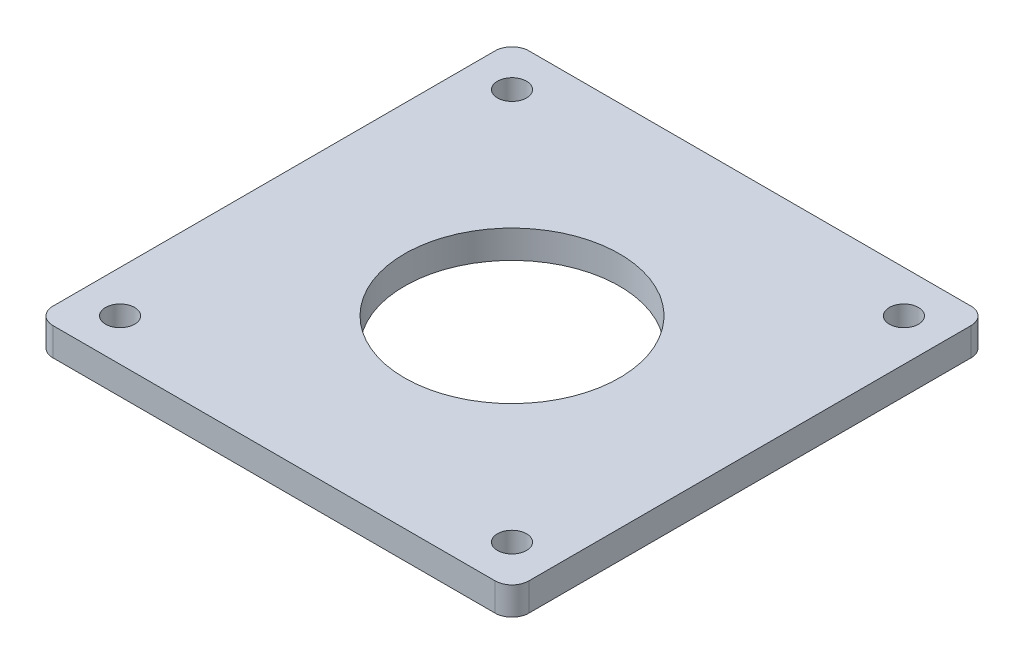
ISO-10303-21;
HEADER;
FILE_DESCRIPTION(('STEP AP214'),'2;1');
FILE_NAME('part.step','',(''),(''),'','','');
FILE_SCHEMA(('AUTOMOTIVE_DESIGN { 1 0 10303 214 1 1 1 1 }'));
ENDSEC;
DATA;
#1=APPLICATION_CONTEXT('core data for automotive mechanical design processes');
#2=APPLICATION_PROTOCOL_DEFINITION('international standard','automotive_design',2000,#1);
#3=PRODUCT_CONTEXT('',#1,'mechanical');
#4=PRODUCT('Part','Part','',(#3));
#5=PRODUCT_RELATED_PRODUCT_CATEGORY('part','',(#4));
#6=PRODUCT_DEFINITION_FORMATION('','',#4);
#7=PRODUCT_DEFINITION_CONTEXT('part definition',#1,'design');
#8=PRODUCT_DEFINITION('design','',#6,#7);
#9=PRODUCT_DEFINITION_SHAPE('','',#8);
#10=(LENGTH_UNIT() NAMED_UNIT(*) SI_UNIT(.MILLI.,.METRE.));
#11=(NAMED_UNIT(*) PLANE_ANGLE_UNIT() SI_UNIT($,.RADIAN.));
#12=(NAMED_UNIT(*) SI_UNIT($,.STERADIAN.) SOLID_ANGLE_UNIT());
#13=UNCERTAINTY_MEASURE_WITH_UNIT(LENGTH_MEASURE(1.E-05),#10,'distance_accuracy_value','');
#14=(GEOMETRIC_REPRESENTATION_CONTEXT(3) GLOBAL_UNCERTAINTY_ASSIGNED_CONTEXT((#13)) GLOBAL_UNIT_ASSIGNED_CONTEXT((#10,
#11,#12)) REPRESENTATION_CONTEXT('',''));
#15=CARTESIAN_POINT('',(0.,0.,0.));
#16=DIRECTION('',(0.,0.,1.));
#17=DIRECTION('',(1.,0.,0.));
#18=AXIS2_PLACEMENT_3D('',#15,#16,#17);
#19=CARTESIAN_POINT('',(0.,2.5,0.));
#20=DIRECTION('',(0.,1.,0.));
#21=DIRECTION('',(0.,0.,1.));
#22=AXIS2_PLACEMENT_3D('',#19,#20,#21);
#23=PLANE('',#22);
#24=CARTESIAN_POINT('',(35.00178566873,2.5,-35.00178566873));
#25=DIRECTION('',(0.,1.,0.));
#26=DIRECTION('',(0.,0.,1.));
#27=AXIS2_PLACEMENT_3D('',#24,#25,#26);
#28=CIRCLE('',#27,2.6);
#29=CARTESIAN_POINT('',(35.00178566873,2.5,-32.40178566873));
#30=VERTEX_POINT('',#29);
#31=EDGE_CURVE('E139',#30,#30,#28,.F.);
#32=ORIENTED_EDGE('',*,*,#31,.T.);
#33=EDGE_LOOP('',(#32));
#34=FACE_BOUND('',#33,.T.);
#35=CARTESIAN_POINT('',(35.00178566873,2.5,35.00178566873));
#36=DIRECTION('',(0.,1.,0.));
#37=DIRECTION('',(0.,0.,1.));
#38=AXIS2_PLACEMENT_3D('',#35,#36,#37);
#39=CIRCLE('',#38,2.6);
#40=CARTESIAN_POINT('',(35.00178566873,2.5,37.60178566873));
#41=VERTEX_POINT('',#40);
#42=EDGE_CURVE('E142',#41,#41,#39,.F.);
#43=ORIENTED_EDGE('',*,*,#42,.T.);
#44=EDGE_LOOP('',(#43));
#45=FACE_BOUND('',#44,.T.);
#46=CARTESIAN_POINT('',(-35.00178566873,2.5,35.00178566873));
#47=DIRECTION('',(0.,1.,0.));
#48=DIRECTION('',(0.,0.,1.));
#49=AXIS2_PLACEMENT_3D('',#46,#47,#48);
#50=CIRCLE('',#49,2.6);
#51=CARTESIAN_POINT('',(-35.00178566873,2.5,37.60178566873));
#52=VERTEX_POINT('',#51);
#53=EDGE_CURVE('E145',#52,#52,#50,.F.);
#54=ORIENTED_EDGE('',*,*,#53,.T.);
#55=EDGE_LOOP('',(#54));
#56=FACE_BOUND('',#55,.T.);
#57=CARTESIAN_POINT('',(-35.00178566873,2.5,-35.00178566873));
#58=DIRECTION('',(0.,1.,0.));
#59=DIRECTION('',(0.,0.,1.));
#60=AXIS2_PLACEMENT_3D('',#57,#58,#59);
#61=CIRCLE('',#60,2.6);
#62=CARTESIAN_POINT('',(-35.00178566873,2.5,-32.40178566873));
#63=VERTEX_POINT('',#62);
#64=EDGE_CURVE('E148',#63,#63,#61,.F.);
#65=ORIENTED_EDGE('',*,*,#64,.T.);
#66=EDGE_LOOP('',(#65));
#67=FACE_BOUND('',#66,.T.);
#68=CARTESIAN_POINT('',(0.,2.5,0.));
#69=DIRECTION('',(0.,1.,0.));
#70=DIRECTION('',(0.,0.,1.));
#71=AXIS2_PLACEMENT_3D('',#68,#69,#70);
#72=CIRCLE('',#71,19.2);
#73=CARTESIAN_POINT('',(0.,2.5,19.2));
#74=VERTEX_POINT('',#73);
#75=EDGE_CURVE('E151',#74,#74,#72,.F.);
#76=ORIENTED_EDGE('',*,*,#75,.T.);
#77=EDGE_LOOP('',(#76));
#78=FACE_BOUND('',#77,.T.);
#79=DIRECTION('',(0.,0.,1.));
#80=VECTOR('',#79,1.);
#81=CARTESIAN_POINT('',(-42.5,2.5,-39.5));
#82=LINE('',#81,#80);
#83=CARTESIAN_POINT('',(-42.5,2.5,39.5));
#84=VERTEX_POINT('',#83);
#85=CARTESIAN_POINT('',(-42.5,2.5,-39.5));
#86=VERTEX_POINT('',#85);
#87=EDGE_CURVE('E93',#84,#86,#82,.F.);
#88=ORIENTED_EDGE('',*,*,#87,.F.);
#89=CARTESIAN_POINT('',(-39.5,2.5,39.5));
#90=DIRECTION('',(0.,1.,0.));
#91=DIRECTION('',(0.,0.,1.));
#92=AXIS2_PLACEMENT_3D('',#89,#90,#91);
#93=CIRCLE('',#92,3.);
#94=CARTESIAN_POINT('',(-39.5,2.5,42.5));
#95=VERTEX_POINT('',#94);
#96=EDGE_CURVE('E20',#95,#84,#93,.F.);
#97=ORIENTED_EDGE('',*,*,#96,.F.);
#98=DIRECTION('',(1.,0.,0.));
#99=VECTOR('',#98,1.);
#100=CARTESIAN_POINT('',(-39.5,2.5,42.5));
#101=LINE('',#100,#99);
#102=CARTESIAN_POINT('',(39.5,2.5,42.5));
#103=VERTEX_POINT('',#102);
#104=EDGE_CURVE('E79',#103,#95,#101,.F.);
#105=ORIENTED_EDGE('',*,*,#104,.F.);
#106=CARTESIAN_POINT('',(39.5,2.5,39.5));
#107=DIRECTION('',(0.,1.,0.));
#108=DIRECTION('',(0.,0.,1.));
#109=AXIS2_PLACEMENT_3D('',#106,#107,#108);
#110=CIRCLE('',#109,3.);
#111=CARTESIAN_POINT('',(42.5,2.5,39.5));
#112=VERTEX_POINT('',#111);
#113=EDGE_CURVE('E100',#112,#103,#110,.F.);
#114=ORIENTED_EDGE('',*,*,#113,.F.);
#115=DIRECTION('',(0.,0.,-1.));
#116=VECTOR('',#115,1.);
#117=CARTESIAN_POINT('',(42.5,2.5,39.5));
#118=LINE('',#117,#116);
#119=CARTESIAN_POINT('',(42.5,2.5,-39.5));
#120=VERTEX_POINT('',#119);
#121=EDGE_CURVE('E111',#120,#112,#118,.F.);
#122=ORIENTED_EDGE('',*,*,#121,.F.);
#123=CARTESIAN_POINT('',(39.5,2.5,-39.5));
#124=DIRECTION('',(0.,1.,0.));
#125=DIRECTION('',(0.,0.,1.));
#126=AXIS2_PLACEMENT_3D('',#123,#124,#125);
#127=CIRCLE('',#126,3.);
#128=CARTESIAN_POINT('',(39.5,2.5,-42.5));
#129=VERTEX_POINT('',#128);
#130=EDGE_CURVE('E157',#129,#120,#127,.F.);
#131=ORIENTED_EDGE('',*,*,#130,.F.);
#132=DIRECTION('',(-1.,0.,0.));
#133=VECTOR('',#132,1.);
#134=CARTESIAN_POINT('',(39.5,2.5,-42.5));
#135=LINE('',#134,#133);
#136=CARTESIAN_POINT('',(-39.5,2.5,-42.5));
#137=VERTEX_POINT('',#136);
#138=EDGE_CURVE('E107',#137,#129,#135,.F.);
#139=ORIENTED_EDGE('',*,*,#138,.F.);
#140=CARTESIAN_POINT('',(-39.5,2.5,-39.5));
#141=DIRECTION('',(0.,1.,0.));
#142=DIRECTION('',(0.,0.,1.));
#143=AXIS2_PLACEMENT_3D('',#140,#141,#142);
#144=CIRCLE('',#143,3.);
#145=EDGE_CURVE('E154',#86,#137,#144,.F.);
#146=ORIENTED_EDGE('',*,*,#145,.F.);
#147=EDGE_LOOP('',(#88,#97,#105,#114,#122,#131,#139,#146));
#148=FACE_BOUND('',#147,.T.);
#149=ADVANCED_FACE('F17',(#34,#45,#56,#67,#78,#148),#23,.T.);
#150=CARTESIAN_POINT('',(-39.5,-2.5,39.5));
#151=DIRECTION('',(0.,1.,0.));
#152=DIRECTION('',(0.,0.,1.));
#153=AXIS2_PLACEMENT_3D('',#150,#151,#152);
#154=CYLINDRICAL_SURFACE('',#153,3.);
#155=DIRECTION('',(0.,1.,0.));
#156=VECTOR('',#155,1.);
#157=CARTESIAN_POINT('',(-42.5,-2.5,39.5));
#158=LINE('',#157,#156);
#159=CARTESIAN_POINT('',(-42.5,-2.5,39.5));
#160=VERTEX_POINT('',#159);
#161=EDGE_CURVE('E106',#160,#84,#158,.T.);
#162=ORIENTED_EDGE('',*,*,#161,.F.);
#163=CARTESIAN_POINT('',(-39.5,-2.5,39.5));
#164=DIRECTION('',(0.,1.,0.));
#165=DIRECTION('',(0.,0.,1.));
#166=AXIS2_PLACEMENT_3D('',#163,#164,#165);
#167=CIRCLE('',#166,3.);
#168=CARTESIAN_POINT('',(-39.5,-2.5,42.5));
#169=VERTEX_POINT('',#168);
#170=EDGE_CURVE('E99',#160,#169,#167,.T.);
#171=ORIENTED_EDGE('',*,*,#170,.T.);
#172=DIRECTION('',(0.,1.,0.));
#173=VECTOR('',#172,1.);
#174=CARTESIAN_POINT('',(-39.5,-2.5,42.5));
#175=LINE('',#174,#173);
#176=EDGE_CURVE('E84',#95,#169,#175,.F.);
#177=ORIENTED_EDGE('',*,*,#176,.F.);
#178=ORIENTED_EDGE('',*,*,#96,.T.);
#179=EDGE_LOOP('',(#162,#171,#177,#178));
#180=FACE_BOUND('',#179,.T.);
#181=ADVANCED_FACE('F98',(#180),#154,.T.);
#182=CARTESIAN_POINT('',(-39.5,-2.5,42.5));
#183=DIRECTION('',(0.,0.,1.));
#184=DIRECTION('',(1.,0.,0.));
#185=AXIS2_PLACEMENT_3D('',#182,#183,#184);
#186=PLANE('',#185);
#187=ORIENTED_EDGE('',*,*,#176,.T.);
#188=DIRECTION('',(1.,0.,0.));
#189=VECTOR('',#188,1.);
#190=CARTESIAN_POINT('',(0.,-2.5,42.5));
#191=LINE('',#190,#189);
#192=CARTESIAN_POINT('',(39.5,-2.5,42.5));
#193=VERTEX_POINT('',#192);
#194=EDGE_CURVE('E137',#169,#193,#191,.T.);
#195=ORIENTED_EDGE('',*,*,#194,.T.);
#196=DIRECTION('',(0.,1.,0.));
#197=VECTOR('',#196,1.);
#198=CARTESIAN_POINT('',(39.5,-2.5,42.5));
#199=LINE('',#198,#197);
#200=EDGE_CURVE('E86',#103,#193,#199,.F.);
#201=ORIENTED_EDGE('',*,*,#200,.F.);
#202=ORIENTED_EDGE('',*,*,#104,.T.);
#203=EDGE_LOOP('',(#187,#195,#201,#202));
#204=FACE_BOUND('',#203,.T.);
#205=ADVANCED_FACE('F81',(#204),#186,.T.);
#206=CARTESIAN_POINT('',(39.5,-2.5,39.5));
#207=DIRECTION('',(0.,1.,0.));
#208=DIRECTION('',(0.,0.,1.));
#209=AXIS2_PLACEMENT_3D('',#206,#207,#208);
#210=CYLINDRICAL_SURFACE('',#209,3.);
#211=ORIENTED_EDGE('',*,*,#200,.T.);
#212=CARTESIAN_POINT('',(39.5,-2.5,39.5));
#213=DIRECTION('',(0.,1.,0.));
#214=DIRECTION('',(0.,0.,1.));
#215=AXIS2_PLACEMENT_3D('',#212,#213,#214);
#216=CIRCLE('',#215,3.);
#217=CARTESIAN_POINT('',(42.5,-2.5,39.5));
#218=VERTEX_POINT('',#217);
#219=EDGE_CURVE('E134',#193,#218,#216,.T.);
#220=ORIENTED_EDGE('',*,*,#219,.T.);
#221=DIRECTION('',(0.,1.,0.));
#222=VECTOR('',#221,1.);
#223=CARTESIAN_POINT('',(42.5,-2.5,39.5));
#224=LINE('',#223,#222);
#225=EDGE_CURVE('E112',#112,#218,#224,.F.);
#226=ORIENTED_EDGE('',*,*,#225,.F.);
#227=ORIENTED_EDGE('',*,*,#113,.T.);
#228=EDGE_LOOP('',(#211,#220,#226,#227));
#229=FACE_BOUND('',#228,.T.);
#230=ADVANCED_FACE('F193',(#229),#210,.T.);
#231=CARTESIAN_POINT('',(42.5,-2.5,39.5));
#232=DIRECTION('',(1.,0.,0.));
#233=DIRECTION('',(0.,0.,-1.));
#234=AXIS2_PLACEMENT_3D('',#231,#232,#233);
#235=PLANE('',#234);
#236=ORIENTED_EDGE('',*,*,#225,.T.);
#237=DIRECTION('',(0.,0.,1.));
#238=VECTOR('',#237,1.);
#239=CARTESIAN_POINT('',(42.5,-2.5,0.));
#240=LINE('',#239,#238);
#241=CARTESIAN_POINT('',(42.5,-2.5,-39.5));
#242=VERTEX_POINT('',#241);
#243=EDGE_CURVE('E133',#218,#242,#240,.F.);
#244=ORIENTED_EDGE('',*,*,#243,.T.);
#245=DIRECTION('',(0.,1.,0.));
#246=VECTOR('',#245,1.);
#247=CARTESIAN_POINT('',(42.5,-2.5,-39.5));
#248=LINE('',#247,#246);
#249=EDGE_CURVE('E110',#120,#242,#248,.F.);
#250=ORIENTED_EDGE('',*,*,#249,.F.);
#251=ORIENTED_EDGE('',*,*,#121,.T.);
#252=EDGE_LOOP('',(#236,#244,#250,#251));
#253=FACE_BOUND('',#252,.T.);
#254=ADVANCED_FACE('F190',(#253),#235,.T.);
#255=CARTESIAN_POINT('',(39.5,-2.5,-39.5));
#256=DIRECTION('',(0.,1.,0.));
#257=DIRECTION('',(0.,0.,1.));
#258=AXIS2_PLACEMENT_3D('',#255,#256,#257);
#259=CYLINDRICAL_SURFACE('',#258,3.);
#260=ORIENTED_EDGE('',*,*,#249,.T.);
#261=CARTESIAN_POINT('',(39.5,-2.5,-39.5));
#262=DIRECTION('',(0.,1.,0.));
#263=DIRECTION('',(0.,0.,1.));
#264=AXIS2_PLACEMENT_3D('',#261,#262,#263);
#265=CIRCLE('',#264,3.);
#266=CARTESIAN_POINT('',(39.5,-2.5,-42.5));
#267=VERTEX_POINT('',#266);
#268=EDGE_CURVE('E130',#242,#267,#265,.T.);
#269=ORIENTED_EDGE('',*,*,#268,.T.);
#270=DIRECTION('',(0.,1.,0.));
#271=VECTOR('',#270,1.);
#272=CARTESIAN_POINT('',(39.5,-2.5,-42.5));
#273=LINE('',#272,#271);
#274=EDGE_CURVE('E109',#129,#267,#273,.F.);
#275=ORIENTED_EDGE('',*,*,#274,.F.);
#276=ORIENTED_EDGE('',*,*,#130,.T.);
#277=EDGE_LOOP('',(#260,#269,#275,#276));
#278=FACE_BOUND('',#277,.T.);
#279=ADVANCED_FACE('F188',(#278),#259,.T.);
#280=CARTESIAN_POINT('',(39.5,-2.5,-42.5));
#281=DIRECTION('',(0.,0.,-1.));
#282=DIRECTION('',(-1.,0.,0.));
#283=AXIS2_PLACEMENT_3D('',#280,#281,#282);
#284=PLANE('',#283);
#285=ORIENTED_EDGE('',*,*,#274,.T.);
#286=DIRECTION('',(1.,0.,0.));
#287=VECTOR('',#286,1.);
#288=CARTESIAN_POINT('',(0.,-2.5,-42.5));
#289=LINE('',#288,#287);
#290=CARTESIAN_POINT('',(-39.5,-2.5,-42.5));
#291=VERTEX_POINT('',#290);
#292=EDGE_CURVE('E129',#267,#291,#289,.F.);
#293=ORIENTED_EDGE('',*,*,#292,.T.);
#294=DIRECTION('',(0.,1.,0.));
#295=VECTOR('',#294,1.);
#296=CARTESIAN_POINT('',(-39.5,-2.5,-42.5));
#297=LINE('',#296,#295);
#298=EDGE_CURVE('E156',#137,#291,#297,.F.);
#299=ORIENTED_EDGE('',*,*,#298,.F.);
#300=ORIENTED_EDGE('',*,*,#138,.T.);
#301=EDGE_LOOP('',(#285,#293,#299,#300));
#302=FACE_BOUND('',#301,.T.);
#303=ADVANCED_FACE('F186',(#302),#284,.T.);
#304=CARTESIAN_POINT('',(-39.5,-2.5,-39.5));
#305=DIRECTION('',(0.,1.,0.));
#306=DIRECTION('',(0.,0.,1.));
#307=AXIS2_PLACEMENT_3D('',#304,#305,#306);
#308=CYLINDRICAL_SURFACE('',#307,3.);
#309=ORIENTED_EDGE('',*,*,#298,.T.);
#310=CARTESIAN_POINT('',(-39.5,-2.5,-39.5));
#311=DIRECTION('',(0.,1.,0.));
#312=DIRECTION('',(0.,0.,1.));
#313=AXIS2_PLACEMENT_3D('',#310,#311,#312);
#314=CIRCLE('',#313,3.);
#315=CARTESIAN_POINT('',(-42.5,-2.5,-39.5));
#316=VERTEX_POINT('',#315);
#317=EDGE_CURVE('E126',#291,#316,#314,.T.);
#318=ORIENTED_EDGE('',*,*,#317,.T.);
#319=DIRECTION('',(0.,1.,0.));
#320=VECTOR('',#319,1.);
#321=CARTESIAN_POINT('',(-42.5,-2.5,-39.5));
#322=LINE('',#321,#320);
#323=EDGE_CURVE('E35',#86,#316,#322,.F.);
#324=ORIENTED_EDGE('',*,*,#323,.F.);
#325=ORIENTED_EDGE('',*,*,#145,.T.);
#326=EDGE_LOOP('',(#309,#318,#324,#325));
#327=FACE_BOUND('',#326,.T.);
#328=ADVANCED_FACE('F182',(#327),#308,.T.);
#329=CARTESIAN_POINT('',(-42.5,-2.5,-39.5));
#330=DIRECTION('',(-1.,0.,0.));
#331=DIRECTION('',(0.,0.,1.));
#332=AXIS2_PLACEMENT_3D('',#329,#330,#331);
#333=PLANE('',#332);
#334=ORIENTED_EDGE('',*,*,#323,.T.);
#335=DIRECTION('',(0.,0.,1.));
#336=VECTOR('',#335,1.);
#337=CARTESIAN_POINT('',(-42.5,-2.5,0.));
#338=LINE('',#337,#336);
#339=EDGE_CURVE('E125',#316,#160,#338,.T.);
#340=ORIENTED_EDGE('',*,*,#339,.T.);
#341=ORIENTED_EDGE('',*,*,#161,.T.);
#342=ORIENTED_EDGE('',*,*,#87,.T.);
#343=EDGE_LOOP('',(#334,#340,#341,#342));
#344=FACE_BOUND('',#343,.T.);
#345=ADVANCED_FACE('F176',(#344),#333,.T.);
#346=CARTESIAN_POINT('',(0.,-2.5,0.));
#347=DIRECTION('',(0.,1.,0.));
#348=DIRECTION('',(0.,0.,1.));
#349=AXIS2_PLACEMENT_3D('',#346,#347,#348);
#350=CYLINDRICAL_SURFACE('',#349,19.2);
#351=ORIENTED_EDGE('',*,*,#75,.F.);
#352=EDGE_LOOP('',(#351));
#353=FACE_BOUND('',#352,.T.);
#354=CARTESIAN_POINT('',(0.,-2.5,0.));
#355=DIRECTION('',(0.,1.,0.));
#356=DIRECTION('',(0.,0.,1.));
#357=AXIS2_PLACEMENT_3D('',#354,#355,#356);
#358=CIRCLE('',#357,19.2);
#359=CARTESIAN_POINT('',(0.,-2.5,19.2));
#360=VERTEX_POINT('',#359);
#361=EDGE_CURVE('E122',#360,#360,#358,.F.);
#362=ORIENTED_EDGE('',*,*,#361,.T.);
#363=EDGE_LOOP('',(#362));
#364=FACE_BOUND('',#363,.T.);
#365=ADVANCED_FACE('F226',(#353,#364),#350,.F.);
#366=CARTESIAN_POINT('',(-35.00178566873,2.5,-35.00178566873));
#367=DIRECTION('',(0.,1.,0.));
#368=DIRECTION('',(0.,0.,1.));
#369=AXIS2_PLACEMENT_3D('',#366,#367,#368);
#370=CYLINDRICAL_SURFACE('',#369,2.6);
#371=ORIENTED_EDGE('',*,*,#64,.F.);
#372=EDGE_LOOP('',(#371));
#373=FACE_BOUND('',#372,.T.);
#374=CARTESIAN_POINT('',(-35.00178566873,-2.5,-35.00178566873));
#375=DIRECTION('',(0.,1.,0.));
#376=DIRECTION('',(0.,0.,1.));
#377=AXIS2_PLACEMENT_3D('',#374,#375,#376);
#378=CIRCLE('',#377,2.6);
#379=CARTESIAN_POINT('',(-35.00178566873,-2.5,-32.40178566873));
#380=VERTEX_POINT('',#379);
#381=EDGE_CURVE('E119',#380,#380,#378,.F.);
#382=ORIENTED_EDGE('',*,*,#381,.T.);
#383=EDGE_LOOP('',(#382));
#384=FACE_BOUND('',#383,.T.);
#385=ADVANCED_FACE('F222',(#373,#384),#370,.F.);
#386=CARTESIAN_POINT('',(-35.00178566873,2.5,35.00178566873));
#387=DIRECTION('',(0.,1.,0.));
#388=DIRECTION('',(0.,0.,1.));
#389=AXIS2_PLACEMENT_3D('',#386,#387,#388);
#390=CYLINDRICAL_SURFACE('',#389,2.6);
#391=ORIENTED_EDGE('',*,*,#53,.F.);
#392=EDGE_LOOP('',(#391));
#393=FACE_BOUND('',#392,.T.);
#394=CARTESIAN_POINT('',(-35.00178566873,-2.5,35.00178566873));
#395=DIRECTION('',(0.,1.,0.));
#396=DIRECTION('',(0.,0.,1.));
#397=AXIS2_PLACEMENT_3D('',#394,#395,#396);
#398=CIRCLE('',#397,2.6);
#399=CARTESIAN_POINT('',(-35.00178566873,-2.5,37.60178566873));
#400=VERTEX_POINT('',#399);
#401=EDGE_CURVE('E116',#400,#400,#398,.F.);
#402=ORIENTED_EDGE('',*,*,#401,.T.);
#403=EDGE_LOOP('',(#402));
#404=FACE_BOUND('',#403,.T.);
#405=ADVANCED_FACE('F218',(#393,#404),#390,.F.);
#406=CARTESIAN_POINT('',(35.00178566873,2.5,35.00178566873));
#407=DIRECTION('',(0.,1.,0.));
#408=DIRECTION('',(0.,0.,1.));
#409=AXIS2_PLACEMENT_3D('',#406,#407,#408);
#410=CYLINDRICAL_SURFACE('',#409,2.6);
#411=ORIENTED_EDGE('',*,*,#42,.F.);
#412=EDGE_LOOP('',(#411));
#413=FACE_BOUND('',#412,.T.);
#414=CARTESIAN_POINT('',(35.00178566873,-2.5,35.00178566873));
#415=DIRECTION('',(0.,1.,0.));
#416=DIRECTION('',(0.,0.,1.));
#417=AXIS2_PLACEMENT_3D('',#414,#415,#416);
#418=CIRCLE('',#417,2.6);
#419=CARTESIAN_POINT('',(35.00178566873,-2.5,37.60178566873));
#420=VERTEX_POINT('',#419);
#421=EDGE_CURVE('E26',#420,#420,#418,.F.);
#422=ORIENTED_EDGE('',*,*,#421,.T.);
#423=EDGE_LOOP('',(#422));
#424=FACE_BOUND('',#423,.T.);
#425=ADVANCED_FACE('F210',(#413,#424),#410,.F.);
#426=CARTESIAN_POINT('',(35.00178566873,2.5,-35.00178566873));
#427=DIRECTION('',(0.,1.,0.));
#428=DIRECTION('',(0.,0.,1.));
#429=AXIS2_PLACEMENT_3D('',#426,#427,#428);
#430=CYLINDRICAL_SURFACE('',#429,2.6);
#431=ORIENTED_EDGE('',*,*,#31,.F.);
#432=EDGE_LOOP('',(#431));
#433=FACE_BOUND('',#432,.T.);
#434=CARTESIAN_POINT('',(35.00178566873,-2.5,-35.00178566873));
#435=DIRECTION('',(0.,1.,0.));
#436=DIRECTION('',(0.,0.,1.));
#437=AXIS2_PLACEMENT_3D('',#434,#435,#436);
#438=CIRCLE('',#437,2.6);
#439=CARTESIAN_POINT('',(35.00178566873,-2.5,-32.40178566873));
#440=VERTEX_POINT('',#439);
#441=EDGE_CURVE('E11',#440,#440,#438,.F.);
#442=ORIENTED_EDGE('',*,*,#441,.T.);
#443=EDGE_LOOP('',(#442));
#444=FACE_BOUND('',#443,.T.);
#445=ADVANCED_FACE('F204',(#433,#444),#430,.F.);
#446=CARTESIAN_POINT('',(0.,-2.5,0.));
#447=DIRECTION('',(0.,1.,0.));
#448=DIRECTION('',(0.,0.,1.));
#449=AXIS2_PLACEMENT_3D('',#446,#447,#448);
#450=PLANE('',#449);
#451=ORIENTED_EDGE('',*,*,#441,.F.);
#452=EDGE_LOOP('',(#451));
#453=FACE_BOUND('',#452,.T.);
#454=ORIENTED_EDGE('',*,*,#421,.F.);
#455=EDGE_LOOP('',(#454));
#456=FACE_BOUND('',#455,.T.);
#457=ORIENTED_EDGE('',*,*,#401,.F.);
#458=EDGE_LOOP('',(#457));
#459=FACE_BOUND('',#458,.T.);
#460=ORIENTED_EDGE('',*,*,#381,.F.);
#461=EDGE_LOOP('',(#460));
#462=FACE_BOUND('',#461,.T.);
#463=ORIENTED_EDGE('',*,*,#361,.F.);
#464=EDGE_LOOP('',(#463));
#465=FACE_BOUND('',#464,.T.);
#466=ORIENTED_EDGE('',*,*,#317,.F.);
#467=ORIENTED_EDGE('',*,*,#292,.F.);
#468=ORIENTED_EDGE('',*,*,#268,.F.);
#469=ORIENTED_EDGE('',*,*,#243,.F.);
#470=ORIENTED_EDGE('',*,*,#219,.F.);
#471=ORIENTED_EDGE('',*,*,#194,.F.);
#472=ORIENTED_EDGE('',*,*,#170,.F.);
#473=ORIENTED_EDGE('',*,*,#339,.F.);
#474=EDGE_LOOP('',(#466,#467,#468,#469,#470,#471,#472,#473));
#475=FACE_BOUND('',#474,.T.);
#476=ADVANCED_FACE('F179',(#453,#456,#459,#462,#465,#475),#450,.F.);
#477=CLOSED_SHELL('',(#149,#181,#205,#230,#254,#279,#303,#328,#345,#365,#385,#405,#425,#445,#476));
#478=MANIFOLD_SOLID_BREP('B1',#477);
#479=ADVANCED_BREP_SHAPE_REPRESENTATION('',(#18,#478),#14);
#480=SHAPE_DEFINITION_REPRESENTATION(#9,#479);
ENDSEC;
END-ISO-10303-21;
